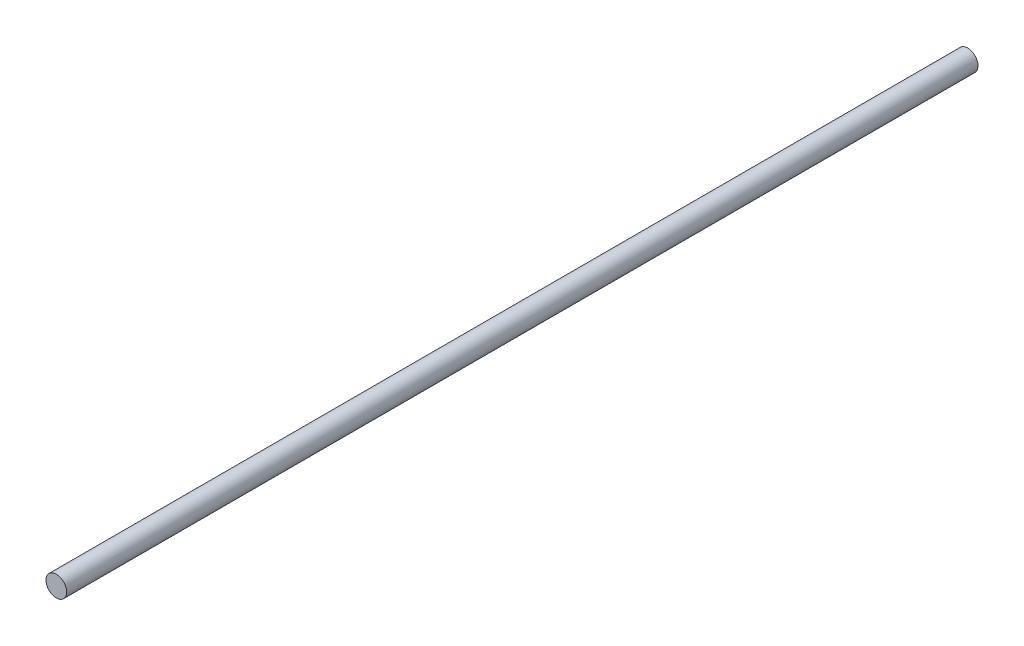
ISO-10303-21;
HEADER;
FILE_DESCRIPTION(('STEP AP214'),'2;1');
FILE_NAME('part.step','',(''),(''),'','','');
FILE_SCHEMA(('AUTOMOTIVE_DESIGN { 1 0 10303 214 1 1 1 1 }'));
ENDSEC;
DATA;
#1=APPLICATION_CONTEXT('core data for automotive mechanical design processes');
#2=APPLICATION_PROTOCOL_DEFINITION('international standard','automotive_design',2000,#1);
#3=PRODUCT_CONTEXT('',#1,'mechanical');
#4=PRODUCT('Part','Part','',(#3));
#5=PRODUCT_RELATED_PRODUCT_CATEGORY('part','',(#4));
#6=PRODUCT_DEFINITION_FORMATION('','',#4);
#7=PRODUCT_DEFINITION_CONTEXT('part definition',#1,'design');
#8=PRODUCT_DEFINITION('design','',#6,#7);
#9=PRODUCT_DEFINITION_SHAPE('','',#8);
#10=(LENGTH_UNIT() NAMED_UNIT(*) SI_UNIT(.MILLI.,.METRE.));
#11=(NAMED_UNIT(*) PLANE_ANGLE_UNIT() SI_UNIT($,.RADIAN.));
#12=(NAMED_UNIT(*) SI_UNIT($,.STERADIAN.) SOLID_ANGLE_UNIT());
#13=UNCERTAINTY_MEASURE_WITH_UNIT(LENGTH_MEASURE(1.E-05),#10,'distance_accuracy_value','');
#14=(GEOMETRIC_REPRESENTATION_CONTEXT(3) GLOBAL_UNCERTAINTY_ASSIGNED_CONTEXT((#13)) GLOBAL_UNIT_ASSIGNED_CONTEXT((#10,
#11,#12)) REPRESENTATION_CONTEXT('',''));
#15=CARTESIAN_POINT('',(0.,0.,0.));
#16=DIRECTION('',(0.,0.,1.));
#17=DIRECTION('',(1.,0.,0.));
#18=AXIS2_PLACEMENT_3D('',#15,#16,#17);
#19=CARTESIAN_POINT('',(0.,0.,280.53538));
#20=DIRECTION('',(0.,0.,-1.));
#21=DIRECTION('',(-1.,0.,0.));
#22=AXIS2_PLACEMENT_3D('',#19,#20,#21);
#23=CYLINDRICAL_SURFACE('',#22,3.175);
#24=CARTESIAN_POINT('',(0.,0.,280.53538));
#25=DIRECTION('',(0.,0.,1.));
#26=DIRECTION('',(1.,0.,0.));
#27=AXIS2_PLACEMENT_3D('',#24,#25,#26);
#28=CIRCLE('',#27,3.175);
#29=CARTESIAN_POINT('',(3.175,0.,280.53538));
#30=VERTEX_POINT('',#29);
#31=EDGE_CURVE('E10',#30,#30,#28,.T.);
#32=ORIENTED_EDGE('',*,*,#31,.F.);
#33=EDGE_LOOP('',(#32));
#34=FACE_BOUND('',#33,.T.);
#35=CARTESIAN_POINT('',(0.,0.,0.));
#36=DIRECTION('',(0.,0.,1.));
#37=DIRECTION('',(1.,0.,0.));
#38=AXIS2_PLACEMENT_3D('',#35,#36,#37);
#39=CIRCLE('',#38,3.175);
#40=CARTESIAN_POINT('',(3.175,0.,0.));
#41=VERTEX_POINT('',#40);
#42=EDGE_CURVE('E46',#41,#41,#39,.T.);
#43=ORIENTED_EDGE('',*,*,#42,.T.);
#44=EDGE_LOOP('',(#43));
#45=FACE_BOUND('',#44,.T.);
#46=ADVANCED_FACE('F43',(#34,#45),#23,.T.);
#47=CARTESIAN_POINT('',(0.,0.,280.53538));
#48=DIRECTION('',(0.,0.,1.));
#49=DIRECTION('',(1.,0.,0.));
#50=AXIS2_PLACEMENT_3D('',#47,#48,#49);
#51=PLANE('',#50);
#52=ORIENTED_EDGE('',*,*,#31,.T.);
#53=EDGE_LOOP('',(#52));
#54=FACE_BOUND('',#53,.T.);
#55=ADVANCED_FACE('F58',(#54),#51,.T.);
#56=CARTESIAN_POINT('',(0.,0.,0.));
#57=DIRECTION('',(0.,0.,1.));
#58=DIRECTION('',(1.,0.,0.));
#59=AXIS2_PLACEMENT_3D('',#56,#57,#58);
#60=PLANE('',#59);
#61=ORIENTED_EDGE('',*,*,#42,.F.);
#62=EDGE_LOOP('',(#61));
#63=FACE_BOUND('',#62,.T.);
#64=ADVANCED_FACE('F56',(#63),#60,.F.);
#65=CLOSED_SHELL('',(#46,#55,#64));
#66=MANIFOLD_SOLID_BREP('B2',#65);
#67=ADVANCED_BREP_SHAPE_REPRESENTATION('',(#18,#66),#14);
#68=SHAPE_DEFINITION_REPRESENTATION(#9,#67);
ENDSEC;
END-ISO-10303-21;
